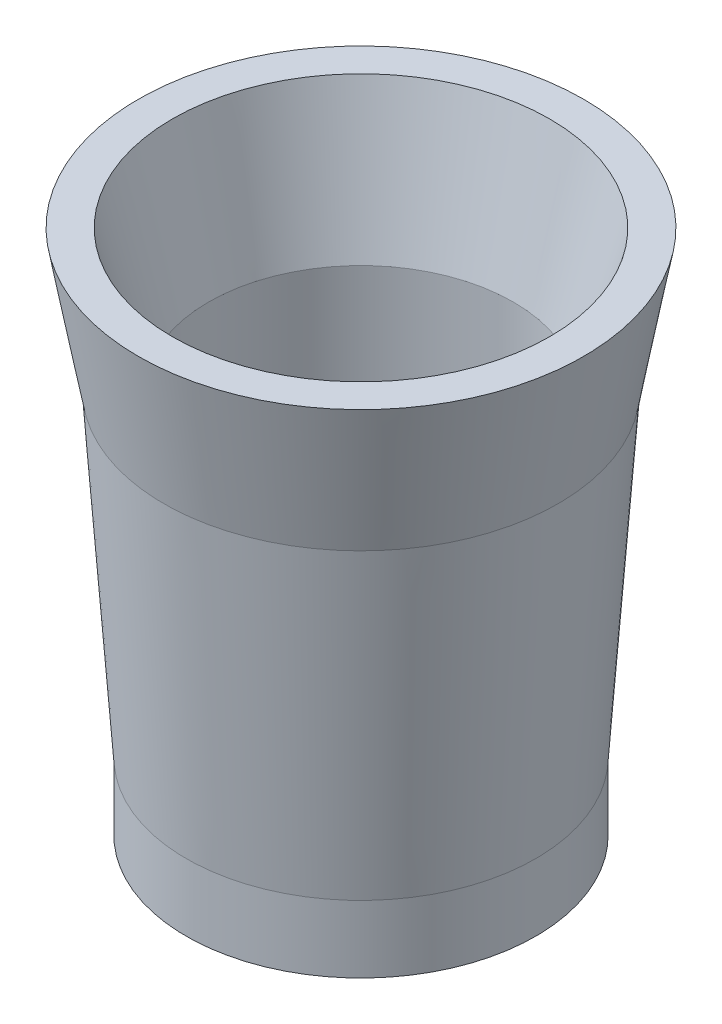
ISO-10303-21;
HEADER;
FILE_DESCRIPTION(('STEP AP214'),'2;1');
FILE_NAME('part.step','',(''),(''),'','','');
FILE_SCHEMA(('AUTOMOTIVE_DESIGN { 1 0 10303 214 1 1 1 1 }'));
ENDSEC;
DATA;
#1=APPLICATION_CONTEXT('core data for automotive mechanical design processes');
#2=APPLICATION_PROTOCOL_DEFINITION('international standard','automotive_design',2000,#1);
#3=PRODUCT_CONTEXT('',#1,'mechanical');
#4=PRODUCT('Part','Part','',(#3));
#5=PRODUCT_RELATED_PRODUCT_CATEGORY('part','',(#4));
#6=PRODUCT_DEFINITION_FORMATION('','',#4);
#7=PRODUCT_DEFINITION_CONTEXT('part definition',#1,'design');
#8=PRODUCT_DEFINITION('design','',#6,#7);
#9=PRODUCT_DEFINITION_SHAPE('','',#8);
#10=(LENGTH_UNIT() NAMED_UNIT(*) SI_UNIT(.MILLI.,.METRE.));
#11=(NAMED_UNIT(*) PLANE_ANGLE_UNIT() SI_UNIT($,.RADIAN.));
#12=(NAMED_UNIT(*) SI_UNIT($,.STERADIAN.) SOLID_ANGLE_UNIT());
#13=UNCERTAINTY_MEASURE_WITH_UNIT(LENGTH_MEASURE(1.E-05),#10,'distance_accuracy_value','');
#14=(GEOMETRIC_REPRESENTATION_CONTEXT(3) GLOBAL_UNCERTAINTY_ASSIGNED_CONTEXT((#13)) GLOBAL_UNIT_ASSIGNED_CONTEXT((#10,
#11,#12)) REPRESENTATION_CONTEXT('',''));
#15=CARTESIAN_POINT('',(0.,0.,0.));
#16=DIRECTION('',(0.,0.,1.));
#17=DIRECTION('',(1.,0.,0.));
#18=AXIS2_PLACEMENT_3D('',#15,#16,#17);
#19=CARTESIAN_POINT('',(0.,39.7879841001668,0.));
#20=DIRECTION('',(0.,1.,0.));
#21=DIRECTION('',(0.,0.,1.));
#22=AXIS2_PLACEMENT_3D('',#19,#20,#21);
#23=PLANE('',#22);
#24=CARTESIAN_POINT('',(0.,39.7879841001668,0.));
#25=DIRECTION('',(0.,-1.,0.));
#26=DIRECTION('',(0.,0.,-1.));
#27=AXIS2_PLACEMENT_3D('',#24,#25,#26);
#28=CIRCLE('',#27,53.469872334376);
#29=CARTESIAN_POINT('',(0.,39.7879841001668,-53.469872334376));
#30=VERTEX_POINT('',#29);
#31=EDGE_CURVE('E10',#30,#30,#28,.T.);
#32=ORIENTED_EDGE('',*,*,#31,.T.);
#33=EDGE_LOOP('',(#32));
#34=FACE_BOUND('',#33,.T.);
#35=CARTESIAN_POINT('',(0.,39.7879841001668,0.));
#36=DIRECTION('',(0.,-1.,0.));
#37=DIRECTION('',(0.,0.,-1.));
#38=AXIS2_PLACEMENT_3D('',#35,#36,#37);
#39=CIRCLE('',#38,63.1204351);
#40=CARTESIAN_POINT('',(0.,39.7879841001668,-63.1204351));
#41=VERTEX_POINT('',#40);
#42=EDGE_CURVE('E80',#41,#41,#39,.T.);
#43=ORIENTED_EDGE('',*,*,#42,.F.);
#44=EDGE_LOOP('',(#43));
#45=FACE_BOUND('',#44,.T.);
#46=ADVANCED_FACE('F41',(#34,#45),#23,.T.);
#47=CARTESIAN_POINT('',(0.,39.7879841001668,0.));
#48=DIRECTION('',(0.,1.,0.));
#49=DIRECTION('',(0.,0.,1.));
#50=AXIS2_PLACEMENT_3D('',#47,#48,#49);
#51=CONICAL_SURFACE('',#50,53.469872334376,0.253072741539186);
#52=CARTESIAN_POINT('',(0.,0.,0.));
#53=DIRECTION('',(0.,-1.,0.));
#54=DIRECTION('',(0.,0.,-1.));
#55=AXIS2_PLACEMENT_3D('',#52,#53,#54);
#56=CIRCLE('',#55,43.18);
#57=CARTESIAN_POINT('',(0.,0.,-43.18));
#58=VERTEX_POINT('',#57);
#59=EDGE_CURVE('E48',#58,#58,#56,.T.);
#60=ORIENTED_EDGE('',*,*,#59,.T.);
#61=EDGE_LOOP('',(#60));
#62=FACE_BOUND('',#61,.T.);
#63=ORIENTED_EDGE('',*,*,#31,.F.);
#64=EDGE_LOOP('',(#63));
#65=FACE_BOUND('',#64,.T.);
#66=ADVANCED_FACE('F89',(#62,#65),#51,.F.);
#67=CARTESIAN_POINT('',(0.,-120.41622299812,0.));
#68=DIRECTION('',(0.,-1.,0.));
#69=DIRECTION('',(0.,0.,-1.));
#70=AXIS2_PLACEMENT_3D('',#67,#68,#69);
#71=CYLINDRICAL_SURFACE('',#70,43.18);
#72=CARTESIAN_POINT('',(0.,-76.2,0.));
#73=DIRECTION('',(0.,-1.,0.));
#74=DIRECTION('',(0.,0.,-1.));
#75=AXIS2_PLACEMENT_3D('',#72,#73,#74);
#76=CIRCLE('',#75,43.18);
#77=CARTESIAN_POINT('',(0.,-76.2,-43.18));
#78=VERTEX_POINT('',#77);
#79=EDGE_CURVE('E53',#78,#78,#76,.T.);
#80=ORIENTED_EDGE('',*,*,#79,.T.);
#81=EDGE_LOOP('',(#80));
#82=FACE_BOUND('',#81,.T.);
#83=ORIENTED_EDGE('',*,*,#59,.F.);
#84=EDGE_LOOP('',(#83));
#85=FACE_BOUND('',#84,.T.);
#86=ADVANCED_FACE('F93',(#82,#85),#71,.F.);
#87=CARTESIAN_POINT('',(0.,-76.2,0.));
#88=DIRECTION('',(0.,1.,0.));
#89=DIRECTION('',(0.,0.,1.));
#90=AXIS2_PLACEMENT_3D('',#87,#88,#89);
#91=PLANE('',#90);
#92=CARTESIAN_POINT('',(0.,-76.2,0.));
#93=DIRECTION('',(0.,-1.,0.));
#94=DIRECTION('',(0.,0.,-1.));
#95=AXIS2_PLACEMENT_3D('',#92,#93,#94);
#96=CIRCLE('',#95,36.1358099992551);
#97=CARTESIAN_POINT('',(0.,-76.2,-36.1358099992551));
#98=VERTEX_POINT('',#97);
#99=EDGE_CURVE('E58',#98,#98,#96,.T.);
#100=ORIENTED_EDGE('',*,*,#99,.T.);
#101=EDGE_LOOP('',(#100));
#102=FACE_BOUND('',#101,.T.);
#103=ORIENTED_EDGE('',*,*,#79,.F.);
#104=EDGE_LOOP('',(#103));
#105=FACE_BOUND('',#104,.T.);
#106=ADVANCED_FACE('F97',(#102,#105),#91,.T.);
#107=CARTESIAN_POINT('',(0.,-76.2,0.));
#108=DIRECTION('',(0.,-1.,0.));
#109=DIRECTION('',(0.,0.,-1.));
#110=AXIS2_PLACEMENT_3D('',#107,#108,#109);
#111=CONICAL_SURFACE('',#110,36.1358099992551,0.209439510239313);
#112=CARTESIAN_POINT('',(0.,-109.340308374392,0.));
#113=DIRECTION('',(0.,-1.,0.));
#114=DIRECTION('',(0.,0.,-1.));
#115=AXIS2_PLACEMENT_3D('',#112,#113,#114);
#116=CIRCLE('',#115,43.18);
#117=CARTESIAN_POINT('',(0.,-109.340308374392,-43.18));
#118=VERTEX_POINT('',#117);
#119=EDGE_CURVE('E64',#118,#118,#116,.T.);
#120=ORIENTED_EDGE('',*,*,#119,.T.);
#121=EDGE_LOOP('',(#120));
#122=FACE_BOUND('',#121,.T.);
#123=ORIENTED_EDGE('',*,*,#99,.F.);
#124=EDGE_LOOP('',(#123));
#125=FACE_BOUND('',#124,.T.);
#126=ADVANCED_FACE('F104',(#122,#125),#111,.F.);
#127=CARTESIAN_POINT('',(0.,-109.340308374392,0.));
#128=DIRECTION('',(0.,1.,0.));
#129=DIRECTION('',(0.,0.,1.));
#130=AXIS2_PLACEMENT_3D('',#127,#128,#129);
#131=PLANE('',#130);
#132=ORIENTED_EDGE('',*,*,#119,.F.);
#133=EDGE_LOOP('',(#132));
#134=FACE_BOUND('',#133,.T.);
#135=CARTESIAN_POINT('',(0.,-109.340308374392,0.));
#136=DIRECTION('',(0.,-1.,0.));
#137=DIRECTION('',(0.,0.,-1.));
#138=AXIS2_PLACEMENT_3D('',#135,#136,#137);
#139=CIRCLE('',#138,49.53);
#140=CARTESIAN_POINT('',(0.,-109.340308374392,-49.53));
#141=VERTEX_POINT('',#140);
#142=EDGE_CURVE('E68',#141,#141,#139,.T.);
#143=ORIENTED_EDGE('',*,*,#142,.T.);
#144=EDGE_LOOP('',(#143));
#145=FACE_BOUND('',#144,.T.);
#146=ADVANCED_FACE('F108',(#134,#145),#131,.F.);
#147=CARTESIAN_POINT('',(0.,-120.41622299812,0.));
#148=DIRECTION('',(0.,-1.,0.));
#149=DIRECTION('',(0.,0.,-1.));
#150=AXIS2_PLACEMENT_3D('',#147,#148,#149);
#151=CYLINDRICAL_SURFACE('',#150,49.53);
#152=ORIENTED_EDGE('',*,*,#142,.F.);
#153=EDGE_LOOP('',(#152));
#154=FACE_BOUND('',#153,.T.);
#155=CARTESIAN_POINT('',(0.,-90.2903083743924,0.));
#156=DIRECTION('',(0.,-1.,0.));
#157=DIRECTION('',(0.,0.,-1.));
#158=AXIS2_PLACEMENT_3D('',#155,#156,#157);
#159=CIRCLE('',#158,49.53);
#160=CARTESIAN_POINT('',(0.,-90.2903083743924,-49.53));
#161=VERTEX_POINT('',#160);
#162=EDGE_CURVE('E72',#161,#161,#159,.T.);
#163=ORIENTED_EDGE('',*,*,#162,.T.);
#164=EDGE_LOOP('',(#163));
#165=FACE_BOUND('',#164,.T.);
#166=ADVANCED_FACE('F112',(#154,#165),#151,.T.);
#167=CARTESIAN_POINT('',(0.,0.,0.));
#168=DIRECTION('',(0.,1.,0.));
#169=DIRECTION('',(0.,0.,1.));
#170=AXIS2_PLACEMENT_3D('',#167,#168,#169);
#171=CONICAL_SURFACE('',#170,55.88,0.07021309124078);
#172=ORIENTED_EDGE('',*,*,#162,.F.);
#173=EDGE_LOOP('',(#172));
#174=FACE_BOUND('',#173,.T.);
#175=CARTESIAN_POINT('',(0.,0.,0.));
#176=DIRECTION('',(0.,-1.,0.));
#177=DIRECTION('',(0.,0.,-1.));
#178=AXIS2_PLACEMENT_3D('',#175,#176,#177);
#179=CIRCLE('',#178,55.88);
#180=CARTESIAN_POINT('',(0.,0.,-55.88));
#181=VERTEX_POINT('',#180);
#182=EDGE_CURVE('E76',#181,#181,#179,.T.);
#183=ORIENTED_EDGE('',*,*,#182,.T.);
#184=EDGE_LOOP('',(#183));
#185=FACE_BOUND('',#184,.T.);
#186=ADVANCED_FACE('F116',(#174,#185),#171,.T.);
#187=CARTESIAN_POINT('',(0.,0.,0.));
#188=DIRECTION('',(0.,1.,0.));
#189=DIRECTION('',(0.,0.,1.));
#190=AXIS2_PLACEMENT_3D('',#187,#188,#189);
#191=CONICAL_SURFACE('',#190,55.88,0.18000570171156);
#192=ORIENTED_EDGE('',*,*,#42,.T.);
#193=EDGE_LOOP('',(#192));
#194=FACE_BOUND('',#193,.T.);
#195=ORIENTED_EDGE('',*,*,#182,.F.);
#196=EDGE_LOOP('',(#195));
#197=FACE_BOUND('',#196,.T.);
#198=ADVANCED_FACE('F85',(#194,#197),#191,.T.);
#199=CLOSED_SHELL('',(#46,#66,#86,#106,#126,#146,#166,#186,#198));
#200=MANIFOLD_SOLID_BREP('B2',#199);
#201=ADVANCED_BREP_SHAPE_REPRESENTATION('',(#18,#200),#14);
#202=SHAPE_DEFINITION_REPRESENTATION(#9,#201);
ENDSEC;
END-ISO-10303-21;
